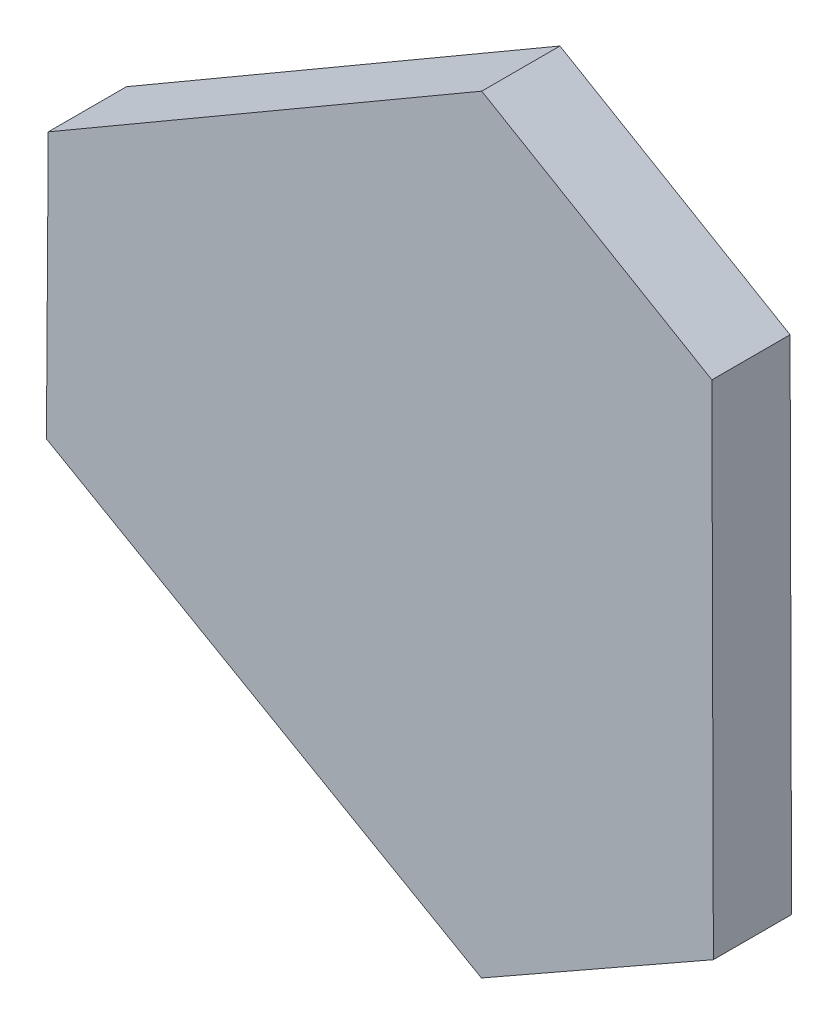
ISO-10303-21;
HEADER;
FILE_DESCRIPTION(('STEP AP214'),'2;1');
FILE_NAME('part.step','',(''),(''),'','','');
FILE_SCHEMA(('AUTOMOTIVE_DESIGN { 1 0 10303 214 1 1 1 1 }'));
ENDSEC;
DATA;
#1=APPLICATION_CONTEXT('core data for automotive mechanical design processes');
#2=APPLICATION_PROTOCOL_DEFINITION('international standard','automotive_design',2000,#1);
#3=PRODUCT_CONTEXT('',#1,'mechanical');
#4=PRODUCT('Part','Part','',(#3));
#5=PRODUCT_RELATED_PRODUCT_CATEGORY('part','',(#4));
#6=PRODUCT_DEFINITION_FORMATION('','',#4);
#7=PRODUCT_DEFINITION_CONTEXT('part definition',#1,'design');
#8=PRODUCT_DEFINITION('design','',#6,#7);
#9=PRODUCT_DEFINITION_SHAPE('','',#8);
#10=(LENGTH_UNIT() NAMED_UNIT(*) SI_UNIT(.MILLI.,.METRE.));
#11=(NAMED_UNIT(*) PLANE_ANGLE_UNIT() SI_UNIT($,.RADIAN.));
#12=(NAMED_UNIT(*) SI_UNIT($,.STERADIAN.) SOLID_ANGLE_UNIT());
#13=UNCERTAINTY_MEASURE_WITH_UNIT(LENGTH_MEASURE(1.E-05),#10,'distance_accuracy_value','');
#14=(GEOMETRIC_REPRESENTATION_CONTEXT(3) GLOBAL_UNCERTAINTY_ASSIGNED_CONTEXT((#13)) GLOBAL_UNIT_ASSIGNED_CONTEXT((#10,
#11,#12)) REPRESENTATION_CONTEXT('',''));
#15=CARTESIAN_POINT('',(0.,0.,0.));
#16=DIRECTION('',(0.,0.,1.));
#17=DIRECTION('',(1.,0.,0.));
#18=AXIS2_PLACEMENT_3D('',#15,#16,#17);
#19=CARTESIAN_POINT('',(86.8240888334661,492.403876506104,50.));
#20=DIRECTION('',(-0.505891376665648,-0.862597191634273,0.));
#21=DIRECTION('',(0.862597191634274,-0.505891376665648,0.));
#22=AXIS2_PLACEMENT_3D('',#19,#20,#21);
#23=PLANE('',#22);
#24=DIRECTION('',(-0.862597191634273,0.505891376665648,0.));
#25=VECTOR('',#24,1.);
#26=CARTESIAN_POINT('',(86.8240888334661,492.403876506104,-50.));
#27=LINE('',#26,#25);
#28=CARTESIAN_POINT('',(381.126409190659,319.803029383801,-50.));
#29=VERTEX_POINT('',#28);
#30=CARTESIAN_POINT('',(86.8240888334661,492.403876506104,-50.));
#31=VERTEX_POINT('',#30);
#32=EDGE_CURVE('E117',#29,#31,#27,.T.);
#33=ORIENTED_EDGE('',*,*,#32,.T.);
#34=DIRECTION('',(0.,0.,-1.));
#35=VECTOR('',#34,1.);
#36=CARTESIAN_POINT('',(86.8240888334661,492.403876506104,50.));
#37=LINE('',#36,#35);
#38=CARTESIAN_POINT('',(86.8240888334661,492.403876506104,50.));
#39=VERTEX_POINT('',#38);
#40=EDGE_CURVE('E11',#39,#31,#37,.T.);
#41=ORIENTED_EDGE('',*,*,#40,.F.);
#42=DIRECTION('',(-0.862597191634273,0.505891376665648,0.));
#43=VECTOR('',#42,1.);
#44=CARTESIAN_POINT('',(86.8240888334661,492.403876506104,50.));
#45=LINE('',#44,#43);
#46=CARTESIAN_POINT('',(381.126409190659,319.803029383801,50.));
#47=VERTEX_POINT('',#46);
#48=EDGE_CURVE('E127',#47,#39,#45,.T.);
#49=ORIENTED_EDGE('',*,*,#48,.F.);
#50=DIRECTION('',(0.,0.,-1.));
#51=VECTOR('',#50,1.);
#52=CARTESIAN_POINT('',(381.126409190659,319.803029383801,50.));
#53=LINE('',#52,#51);
#54=EDGE_CURVE('E113',#47,#29,#53,.T.);
#55=ORIENTED_EDGE('',*,*,#54,.T.);
#56=EDGE_LOOP('',(#33,#41,#49,#55));
#57=FACE_BOUND('',#56,.T.);
#58=ADVANCED_FACE('F33',(#57),#23,.F.);
#59=CARTESIAN_POINT('',(-467.520752248923,170.163637720353,50.));
#60=DIRECTION('',(0.50255836131902,-0.864543286058218,0.));
#61=DIRECTION('',(0.864543286058218,0.50255836131902,0.));
#62=AXIS2_PLACEMENT_3D('',#59,#60,#61);
#63=PLANE('',#62);
#64=DIRECTION('',(-0.864543286058218,-0.50255836131902,0.));
#65=VECTOR('',#64,1.);
#66=CARTESIAN_POINT('',(-467.520752248923,170.163637720353,-50.));
#67=LINE('',#66,#65);
#68=CARTESIAN_POINT('',(-467.520752248923,170.163637720353,-50.));
#69=VERTEX_POINT('',#68);
#70=EDGE_CURVE('E120',#31,#69,#67,.T.);
#71=ORIENTED_EDGE('',*,*,#70,.T.);
#72=DIRECTION('',(0.,0.,-1.));
#73=VECTOR('',#72,1.);
#74=CARTESIAN_POINT('',(-467.520752248923,170.163637720353,50.));
#75=LINE('',#74,#73);
#76=CARTESIAN_POINT('',(-467.520752248923,170.163637720353,50.));
#77=VERTEX_POINT('',#76);
#78=EDGE_CURVE('E41',#77,#69,#75,.T.);
#79=ORIENTED_EDGE('',*,*,#78,.F.);
#80=DIRECTION('',(-0.864543286058218,-0.50255836131902,0.));
#81=VECTOR('',#80,1.);
#82=CARTESIAN_POINT('',(-467.520752248923,170.163637720353,50.));
#83=LINE('',#82,#81);
#84=EDGE_CURVE('E86',#39,#77,#83,.T.);
#85=ORIENTED_EDGE('',*,*,#84,.F.);
#86=ORIENTED_EDGE('',*,*,#40,.T.);
#87=EDGE_LOOP('',(#71,#79,#85,#86));
#88=FACE_BOUND('',#87,.T.);
#89=ADVANCED_FACE('F151',(#88),#63,.F.);
#90=CARTESIAN_POINT('',(-469.846310392955,-171.010071662833,50.));
#91=DIRECTION('',(0.999976769521219,-0.00681618793079644,0.));
#92=DIRECTION('',(0.00681618793079644,0.999976769521219,0.));
#93=AXIS2_PLACEMENT_3D('',#90,#91,#92);
#94=PLANE('',#93);
#95=DIRECTION('',(-0.00681618793079644,-0.999976769521218,0.));
#96=VECTOR('',#95,1.);
#97=CARTESIAN_POINT('',(-469.846310392955,-171.010071662833,-50.));
#98=LINE('',#97,#96);
#99=CARTESIAN_POINT('',(-469.846310392955,-171.010071662833,-50.));
#100=VERTEX_POINT('',#99);
#101=EDGE_CURVE('E122',#69,#100,#98,.T.);
#102=ORIENTED_EDGE('',*,*,#101,.T.);
#103=DIRECTION('',(0.,0.,-1.));
#104=VECTOR('',#103,1.);
#105=CARTESIAN_POINT('',(-469.846310392955,-171.010071662833,50.));
#106=LINE('',#105,#104);
#107=CARTESIAN_POINT('',(-469.846310392955,-171.010071662833,50.));
#108=VERTEX_POINT('',#107);
#109=EDGE_CURVE('E108',#108,#100,#106,.T.);
#110=ORIENTED_EDGE('',*,*,#109,.F.);
#111=DIRECTION('',(-0.00681618793079644,-0.999976769521218,0.));
#112=VECTOR('',#111,1.);
#113=CARTESIAN_POINT('',(-469.846310392955,-171.010071662833,50.));
#114=LINE('',#113,#112);
#115=EDGE_CURVE('E99',#77,#108,#114,.T.);
#116=ORIENTED_EDGE('',*,*,#115,.F.);
#117=ORIENTED_EDGE('',*,*,#78,.T.);
#118=EDGE_LOOP('',(#102,#110,#116,#117));
#119=FACE_BOUND('',#118,.T.);
#120=ADVANCED_FACE('F133',(#119),#94,.F.);
#121=CARTESIAN_POINT('',(86.394343058264,-489.966667104155,50.));
#122=DIRECTION('',(0.497437267738184,0.867499950815659,0.));
#123=DIRECTION('',(-0.867499950815659,0.497437267738184,0.));
#124=AXIS2_PLACEMENT_3D('',#121,#122,#123);
#125=PLANE('',#124);
#126=DIRECTION('',(0.867499950815659,-0.497437267738184,0.));
#127=VECTOR('',#126,1.);
#128=CARTESIAN_POINT('',(86.394343058264,-489.966667104155,-50.));
#129=LINE('',#128,#127);
#130=CARTESIAN_POINT('',(86.394343058264,-489.966667104155,-50.));
#131=VERTEX_POINT('',#130);
#132=EDGE_CURVE('E107',#100,#131,#129,.T.);
#133=ORIENTED_EDGE('',*,*,#132,.T.);
#134=DIRECTION('',(0.,0.,-1.));
#135=VECTOR('',#134,1.);
#136=CARTESIAN_POINT('',(86.394343058264,-489.966667104155,50.));
#137=LINE('',#136,#135);
#138=CARTESIAN_POINT('',(86.394343058264,-489.966667104155,50.));
#139=VERTEX_POINT('',#138);
#140=EDGE_CURVE('E104',#139,#131,#137,.T.);
#141=ORIENTED_EDGE('',*,*,#140,.F.);
#142=DIRECTION('',(0.867499950815659,-0.497437267738184,0.));
#143=VECTOR('',#142,1.);
#144=CARTESIAN_POINT('',(86.394343058264,-489.966667104155,50.));
#145=LINE('',#144,#143);
#146=EDGE_CURVE('E93',#108,#139,#145,.T.);
#147=ORIENTED_EDGE('',*,*,#146,.F.);
#148=ORIENTED_EDGE('',*,*,#109,.T.);
#149=EDGE_LOOP('',(#133,#141,#147,#148));
#150=FACE_BOUND('',#149,.T.);
#151=ADVANCED_FACE('F105',(#150),#125,.F.);
#152=CARTESIAN_POINT('',(383.022221559489,-321.39380484327,50.));
#153=DIRECTION('',(-0.494085392855571,0.86941337956507,0.));
#154=DIRECTION('',(-0.86941337956507,-0.494085392855571,0.));
#155=AXIS2_PLACEMENT_3D('',#152,#153,#154);
#156=PLANE('',#155);
#157=DIRECTION('',(0.86941337956507,0.494085392855571,0.));
#158=VECTOR('',#157,1.);
#159=CARTESIAN_POINT('',(383.022221559489,-321.39380484327,-50.));
#160=LINE('',#159,#158);
#161=CARTESIAN_POINT('',(383.022221559489,-321.39380484327,-50.));
#162=VERTEX_POINT('',#161);
#163=EDGE_CURVE('E72',#131,#162,#160,.T.);
#164=ORIENTED_EDGE('',*,*,#163,.T.);
#165=DIRECTION('',(0.,0.,-1.));
#166=VECTOR('',#165,1.);
#167=CARTESIAN_POINT('',(383.022221559489,-321.39380484327,50.));
#168=LINE('',#167,#166);
#169=CARTESIAN_POINT('',(383.022221559489,-321.39380484327,50.));
#170=VERTEX_POINT('',#169);
#171=EDGE_CURVE('E109',#170,#162,#168,.T.);
#172=ORIENTED_EDGE('',*,*,#171,.F.);
#173=DIRECTION('',(0.86941337956507,0.494085392855571,0.));
#174=VECTOR('',#173,1.);
#175=CARTESIAN_POINT('',(383.022221559489,-321.39380484327,50.));
#176=LINE('',#175,#174);
#177=EDGE_CURVE('E97',#139,#170,#176,.T.);
#178=ORIENTED_EDGE('',*,*,#177,.F.);
#179=ORIENTED_EDGE('',*,*,#140,.T.);
#180=EDGE_LOOP('',(#164,#172,#178,#179));
#181=FACE_BOUND('',#180,.T.);
#182=ADVANCED_FACE('F111',(#181),#156,.F.);
#183=CARTESIAN_POINT('',(381.126409190659,319.803029383801,50.));
#184=DIRECTION('',(-0.999995629057203,-0.00295666475744163,0.));
#185=DIRECTION('',(0.00295666475744163,-0.999995629057204,0.));
#186=AXIS2_PLACEMENT_3D('',#183,#184,#185);
#187=PLANE('',#186);
#188=DIRECTION('',(-0.00295666475744163,0.999995629057203,0.));
#189=VECTOR('',#188,1.);
#190=CARTESIAN_POINT('',(381.126409190659,319.803029383801,-50.));
#191=LINE('',#190,#189);
#192=EDGE_CURVE('E78',#162,#29,#191,.T.);
#193=ORIENTED_EDGE('',*,*,#192,.T.);
#194=ORIENTED_EDGE('',*,*,#54,.F.);
#195=DIRECTION('',(-0.00295666475744163,0.999995629057203,0.));
#196=VECTOR('',#195,1.);
#197=CARTESIAN_POINT('',(381.126409190659,319.803029383801,50.));
#198=LINE('',#197,#196);
#199=EDGE_CURVE('E49',#170,#47,#198,.T.);
#200=ORIENTED_EDGE('',*,*,#199,.F.);
#201=ORIENTED_EDGE('',*,*,#171,.T.);
#202=EDGE_LOOP('',(#193,#194,#200,#201));
#203=FACE_BOUND('',#202,.T.);
#204=ADVANCED_FACE('F140',(#203),#187,.F.);
#205=CARTESIAN_POINT('',(0.,0.,50.));
#206=DIRECTION('',(0.,0.,1.));
#207=DIRECTION('',(1.,0.,0.));
#208=AXIS2_PLACEMENT_3D('',#205,#206,#207);
#209=PLANE('',#208);
#210=ORIENTED_EDGE('',*,*,#48,.T.);
#211=ORIENTED_EDGE('',*,*,#84,.T.);
#212=ORIENTED_EDGE('',*,*,#115,.T.);
#213=ORIENTED_EDGE('',*,*,#146,.T.);
#214=ORIENTED_EDGE('',*,*,#177,.T.);
#215=ORIENTED_EDGE('',*,*,#199,.T.);
#216=EDGE_LOOP('',(#210,#211,#212,#213,#214,#215));
#217=FACE_BOUND('',#216,.T.);
#218=ADVANCED_FACE('F95',(#217),#209,.T.);
#219=CARTESIAN_POINT('',(0.,0.,-50.));
#220=DIRECTION('',(0.,0.,1.));
#221=DIRECTION('',(1.,0.,0.));
#222=AXIS2_PLACEMENT_3D('',#219,#220,#221);
#223=PLANE('',#222);
#224=ORIENTED_EDGE('',*,*,#32,.F.);
#225=ORIENTED_EDGE('',*,*,#192,.F.);
#226=ORIENTED_EDGE('',*,*,#163,.F.);
#227=ORIENTED_EDGE('',*,*,#132,.F.);
#228=ORIENTED_EDGE('',*,*,#101,.F.);
#229=ORIENTED_EDGE('',*,*,#70,.F.);
#230=EDGE_LOOP('',(#224,#225,#226,#227,#228,#229));
#231=FACE_BOUND('',#230,.T.);
#232=ADVANCED_FACE('F136',(#231),#223,.F.);
#233=CLOSED_SHELL('',(#58,#89,#120,#151,#182,#204,#218,#232));
#234=MANIFOLD_SOLID_BREP('B2',#233);
#235=ADVANCED_BREP_SHAPE_REPRESENTATION('',(#18,#234),#14);
#236=SHAPE_DEFINITION_REPRESENTATION(#9,#235);
ENDSEC;
END-ISO-10303-21;
